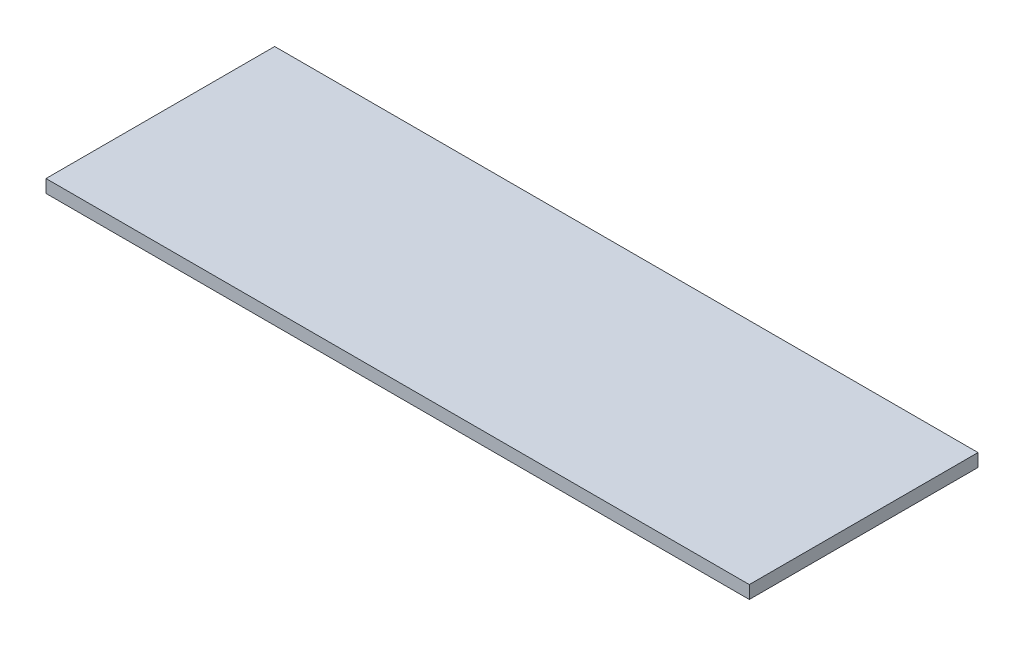
ISO-10303-21;
HEADER;
FILE_DESCRIPTION(('STEP AP214'),'2;1');
FILE_NAME('part.step','',(''),(''),'','','');
FILE_SCHEMA(('AUTOMOTIVE_DESIGN { 1 0 10303 214 1 1 1 1 }'));
ENDSEC;
DATA;
#1=APPLICATION_CONTEXT('core data for automotive mechanical design processes');
#2=APPLICATION_PROTOCOL_DEFINITION('international standard','automotive_design',2000,#1);
#3=PRODUCT_CONTEXT('',#1,'mechanical');
#4=PRODUCT('Part','Part','',(#3));
#5=PRODUCT_RELATED_PRODUCT_CATEGORY('part','',(#4));
#6=PRODUCT_DEFINITION_FORMATION('','',#4);
#7=PRODUCT_DEFINITION_CONTEXT('part definition',#1,'design');
#8=PRODUCT_DEFINITION('design','',#6,#7);
#9=PRODUCT_DEFINITION_SHAPE('','',#8);
#10=(LENGTH_UNIT() NAMED_UNIT(*) SI_UNIT(.MILLI.,.METRE.));
#11=(NAMED_UNIT(*) PLANE_ANGLE_UNIT() SI_UNIT($,.RADIAN.));
#12=(NAMED_UNIT(*) SI_UNIT($,.STERADIAN.) SOLID_ANGLE_UNIT());
#13=UNCERTAINTY_MEASURE_WITH_UNIT(LENGTH_MEASURE(1.E-05),#10,'distance_accuracy_value','');
#14=(GEOMETRIC_REPRESENTATION_CONTEXT(3) GLOBAL_UNCERTAINTY_ASSIGNED_CONTEXT((#13)) GLOBAL_UNIT_ASSIGNED_CONTEXT((#10,
#11,#12)) REPRESENTATION_CONTEXT('',''));
#15=CARTESIAN_POINT('',(0.,0.,0.));
#16=DIRECTION('',(0.,0.,1.));
#17=DIRECTION('',(1.,0.,0.));
#18=AXIS2_PLACEMENT_3D('',#15,#16,#17);
#19=CARTESIAN_POINT('',(-163.,6.,53.));
#20=DIRECTION('',(1.,0.,0.));
#21=DIRECTION('',(0.,0.,-1.));
#22=AXIS2_PLACEMENT_3D('',#19,#20,#21);
#23=PLANE('',#22);
#24=DIRECTION('',(0.,0.,1.));
#25=VECTOR('',#24,1.);
#26=CARTESIAN_POINT('',(-163.,0.,53.));
#27=LINE('',#26,#25);
#28=CARTESIAN_POINT('',(-163.,0.,-53.));
#29=VERTEX_POINT('',#28);
#30=CARTESIAN_POINT('',(-163.,0.,53.));
#31=VERTEX_POINT('',#30);
#32=EDGE_CURVE('E99',#29,#31,#27,.T.);
#33=ORIENTED_EDGE('',*,*,#32,.T.);
#34=DIRECTION('',(0.,-1.,0.));
#35=VECTOR('',#34,1.);
#36=CARTESIAN_POINT('',(-163.,6.,53.));
#37=LINE('',#36,#35);
#38=CARTESIAN_POINT('',(-163.,6.,53.));
#39=VERTEX_POINT('',#38);
#40=EDGE_CURVE('E11',#39,#31,#37,.T.);
#41=ORIENTED_EDGE('',*,*,#40,.F.);
#42=DIRECTION('',(0.,0.,1.));
#43=VECTOR('',#42,1.);
#44=CARTESIAN_POINT('',(-163.,6.,53.));
#45=LINE('',#44,#43);
#46=CARTESIAN_POINT('',(-163.,6.,-53.));
#47=VERTEX_POINT('',#46);
#48=EDGE_CURVE('E87',#47,#39,#45,.T.);
#49=ORIENTED_EDGE('',*,*,#48,.F.);
#50=DIRECTION('',(0.,-1.,0.));
#51=VECTOR('',#50,1.);
#52=CARTESIAN_POINT('',(-163.,6.,-53.));
#53=LINE('',#52,#51);
#54=EDGE_CURVE('E95',#47,#29,#53,.T.);
#55=ORIENTED_EDGE('',*,*,#54,.T.);
#56=EDGE_LOOP('',(#33,#41,#49,#55));
#57=FACE_BOUND('',#56,.T.);
#58=ADVANCED_FACE('F36',(#57),#23,.F.);
#59=CARTESIAN_POINT('',(163.,6.,53.));
#60=DIRECTION('',(0.,0.,-1.));
#61=DIRECTION('',(-1.,0.,0.));
#62=AXIS2_PLACEMENT_3D('',#59,#60,#61);
#63=PLANE('',#62);
#64=DIRECTION('',(1.,0.,0.));
#65=VECTOR('',#64,1.);
#66=CARTESIAN_POINT('',(163.,0.,53.));
#67=LINE('',#66,#65);
#68=CARTESIAN_POINT('',(163.,0.,53.));
#69=VERTEX_POINT('',#68);
#70=EDGE_CURVE('E91',#31,#69,#67,.T.);
#71=ORIENTED_EDGE('',*,*,#70,.T.);
#72=DIRECTION('',(0.,-1.,0.));
#73=VECTOR('',#72,1.);
#74=CARTESIAN_POINT('',(163.,6.,53.));
#75=LINE('',#74,#73);
#76=CARTESIAN_POINT('',(163.,6.,53.));
#77=VERTEX_POINT('',#76);
#78=EDGE_CURVE('E44',#77,#69,#75,.T.);
#79=ORIENTED_EDGE('',*,*,#78,.F.);
#80=DIRECTION('',(1.,0.,0.));
#81=VECTOR('',#80,1.);
#82=CARTESIAN_POINT('',(163.,6.,53.));
#83=LINE('',#82,#81);
#84=EDGE_CURVE('E82',#39,#77,#83,.T.);
#85=ORIENTED_EDGE('',*,*,#84,.F.);
#86=ORIENTED_EDGE('',*,*,#40,.T.);
#87=EDGE_LOOP('',(#71,#79,#85,#86));
#88=FACE_BOUND('',#87,.T.);
#89=ADVANCED_FACE('F90',(#88),#63,.F.);
#90=CARTESIAN_POINT('',(163.,6.,53.));
#91=DIRECTION('',(-1.,0.,0.));
#92=DIRECTION('',(0.,0.,1.));
#93=AXIS2_PLACEMENT_3D('',#90,#91,#92);
#94=PLANE('',#93);
#95=DIRECTION('',(0.,0.,-1.));
#96=VECTOR('',#95,1.);
#97=CARTESIAN_POINT('',(163.,0.,53.));
#98=LINE('',#97,#96);
#99=CARTESIAN_POINT('',(163.,0.,-53.));
#100=VERTEX_POINT('',#99);
#101=EDGE_CURVE('E69',#69,#100,#98,.T.);
#102=ORIENTED_EDGE('',*,*,#101,.T.);
#103=DIRECTION('',(0.,-1.,0.));
#104=VECTOR('',#103,1.);
#105=CARTESIAN_POINT('',(163.,6.,-53.));
#106=LINE('',#105,#104);
#107=CARTESIAN_POINT('',(163.,6.,-53.));
#108=VERTEX_POINT('',#107);
#109=EDGE_CURVE('E92',#108,#100,#106,.T.);
#110=ORIENTED_EDGE('',*,*,#109,.F.);
#111=DIRECTION('',(0.,0.,-1.));
#112=VECTOR('',#111,1.);
#113=CARTESIAN_POINT('',(163.,6.,53.));
#114=LINE('',#113,#112);
#115=EDGE_CURVE('E85',#77,#108,#114,.T.);
#116=ORIENTED_EDGE('',*,*,#115,.F.);
#117=ORIENTED_EDGE('',*,*,#78,.T.);
#118=EDGE_LOOP('',(#102,#110,#116,#117));
#119=FACE_BOUND('',#118,.T.);
#120=ADVANCED_FACE('F93',(#119),#94,.F.);
#121=CARTESIAN_POINT('',(163.,6.,-53.));
#122=DIRECTION('',(0.,0.,1.));
#123=DIRECTION('',(1.,0.,0.));
#124=AXIS2_PLACEMENT_3D('',#121,#122,#123);
#125=PLANE('',#124);
#126=DIRECTION('',(-1.,0.,0.));
#127=VECTOR('',#126,1.);
#128=CARTESIAN_POINT('',(163.,0.,-53.));
#129=LINE('',#128,#127);
#130=EDGE_CURVE('E75',#100,#29,#129,.T.);
#131=ORIENTED_EDGE('',*,*,#130,.T.);
#132=ORIENTED_EDGE('',*,*,#54,.F.);
#133=DIRECTION('',(-1.,0.,0.));
#134=VECTOR('',#133,1.);
#135=CARTESIAN_POINT('',(163.,6.,-53.));
#136=LINE('',#135,#134);
#137=EDGE_CURVE('E52',#108,#47,#136,.T.);
#138=ORIENTED_EDGE('',*,*,#137,.F.);
#139=ORIENTED_EDGE('',*,*,#109,.T.);
#140=EDGE_LOOP('',(#131,#132,#138,#139));
#141=FACE_BOUND('',#140,.T.);
#142=ADVANCED_FACE('F106',(#141),#125,.F.);
#143=CARTESIAN_POINT('',(0.,6.,0.));
#144=DIRECTION('',(0.,1.,0.));
#145=DIRECTION('',(0.,0.,1.));
#146=AXIS2_PLACEMENT_3D('',#143,#144,#145);
#147=PLANE('',#146);
#148=ORIENTED_EDGE('',*,*,#48,.T.);
#149=ORIENTED_EDGE('',*,*,#84,.T.);
#150=ORIENTED_EDGE('',*,*,#115,.T.);
#151=ORIENTED_EDGE('',*,*,#137,.T.);
#152=EDGE_LOOP('',(#148,#149,#150,#151));
#153=FACE_BOUND('',#152,.T.);
#154=ADVANCED_FACE('F83',(#153),#147,.T.);
#155=CARTESIAN_POINT('',(0.,0.,0.));
#156=DIRECTION('',(0.,1.,0.));
#157=DIRECTION('',(0.,0.,1.));
#158=AXIS2_PLACEMENT_3D('',#155,#156,#157);
#159=PLANE('',#158);
#160=ORIENTED_EDGE('',*,*,#32,.F.);
#161=ORIENTED_EDGE('',*,*,#130,.F.);
#162=ORIENTED_EDGE('',*,*,#101,.F.);
#163=ORIENTED_EDGE('',*,*,#70,.F.);
#164=EDGE_LOOP('',(#160,#161,#162,#163));
#165=FACE_BOUND('',#164,.T.);
#166=ADVANCED_FACE('F109',(#165),#159,.F.);
#167=CLOSED_SHELL('',(#58,#89,#120,#142,#154,#166));
#168=MANIFOLD_SOLID_BREP('B2',#167);
#169=ADVANCED_BREP_SHAPE_REPRESENTATION('',(#18,#168),#14);
#170=SHAPE_DEFINITION_REPRESENTATION(#9,#169);
ENDSEC;
END-ISO-10303-21;
